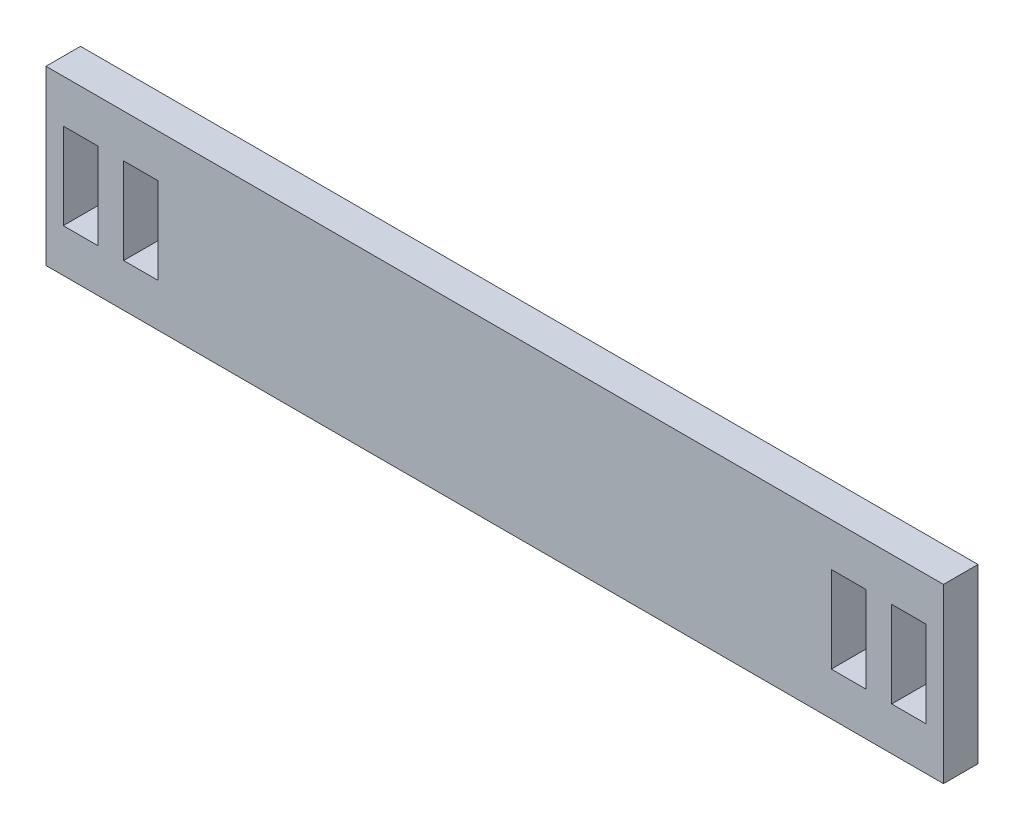
ISO-10303-21;
HEADER;
FILE_DESCRIPTION(('STEP AP214'),'2;1');
FILE_NAME('part.step','',(''),(''),'','','');
FILE_SCHEMA(('AUTOMOTIVE_DESIGN { 1 0 10303 214 1 1 1 1 }'));
ENDSEC;
DATA;
#1=APPLICATION_CONTEXT('core data for automotive mechanical design processes');
#2=APPLICATION_PROTOCOL_DEFINITION('international standard','automotive_design',2000,#1);
#3=PRODUCT_CONTEXT('',#1,'mechanical');
#4=PRODUCT('Part','Part','',(#3));
#5=PRODUCT_RELATED_PRODUCT_CATEGORY('part','',(#4));
#6=PRODUCT_DEFINITION_FORMATION('','',#4);
#7=PRODUCT_DEFINITION_CONTEXT('part definition',#1,'design');
#8=PRODUCT_DEFINITION('design','',#6,#7);
#9=PRODUCT_DEFINITION_SHAPE('','',#8);
#10=(LENGTH_UNIT() NAMED_UNIT(*) SI_UNIT(.MILLI.,.METRE.));
#11=(NAMED_UNIT(*) PLANE_ANGLE_UNIT() SI_UNIT($,.RADIAN.));
#12=(NAMED_UNIT(*) SI_UNIT($,.STERADIAN.) SOLID_ANGLE_UNIT());
#13=UNCERTAINTY_MEASURE_WITH_UNIT(LENGTH_MEASURE(1.E-05),#10,'distance_accuracy_value','');
#14=(GEOMETRIC_REPRESENTATION_CONTEXT(3) GLOBAL_UNCERTAINTY_ASSIGNED_CONTEXT((#13)) GLOBAL_UNIT_ASSIGNED_CONTEXT((#10,
#11,#12)) REPRESENTATION_CONTEXT('',''));
#15=CARTESIAN_POINT('',(0.,0.,0.));
#16=DIRECTION('',(0.,0.,1.));
#17=DIRECTION('',(1.,0.,0.));
#18=AXIS2_PLACEMENT_3D('',#15,#16,#17);
#19=CARTESIAN_POINT('',(0.,0.,2.));
#20=DIRECTION('',(0.,0.,-1.));
#21=DIRECTION('',(-1.,0.,0.));
#22=AXIS2_PLACEMENT_3D('',#19,#20,#21);
#23=PLANE('',#22);
#24=DIRECTION('',(0.,1.,0.));
#25=VECTOR('',#24,1.);
#26=CARTESIAN_POINT('',(-46.,15.,2.));
#27=LINE('',#26,#25);
#28=CARTESIAN_POINT('',(-46.,5.,2.));
#29=VERTEX_POINT('',#28);
#30=CARTESIAN_POINT('',(-46.,15.,2.));
#31=VERTEX_POINT('',#30);
#32=EDGE_CURVE('E207',#29,#31,#27,.T.);
#33=ORIENTED_EDGE('',*,*,#32,.F.);
#34=DIRECTION('',(1.,0.,0.));
#35=VECTOR('',#34,1.);
#36=CARTESIAN_POINT('',(-46.,5.,2.));
#37=LINE('',#36,#35);
#38=CARTESIAN_POINT('',(-50.,5.,2.));
#39=VERTEX_POINT('',#38);
#40=EDGE_CURVE('E215',#39,#29,#37,.T.);
#41=ORIENTED_EDGE('',*,*,#40,.F.);
#42=DIRECTION('',(0.,-1.,0.));
#43=VECTOR('',#42,1.);
#44=CARTESIAN_POINT('',(-50.,15.,2.));
#45=LINE('',#44,#43);
#46=CARTESIAN_POINT('',(-50.,15.,2.));
#47=VERTEX_POINT('',#46);
#48=EDGE_CURVE('E212',#47,#39,#45,.T.);
#49=ORIENTED_EDGE('',*,*,#48,.F.);
#50=DIRECTION('',(-1.,0.,0.));
#51=VECTOR('',#50,1.);
#52=CARTESIAN_POINT('',(-46.,15.,2.));
#53=LINE('',#52,#51);
#54=EDGE_CURVE('E209',#31,#47,#53,.T.);
#55=ORIENTED_EDGE('',*,*,#54,.F.);
#56=EDGE_LOOP('',(#33,#41,#49,#55));
#57=FACE_BOUND('',#56,.T.);
#58=DIRECTION('',(0.,-1.,0.));
#59=VECTOR('',#58,1.);
#60=CARTESIAN_POINT('',(46.,15.,2.));
#61=LINE('',#60,#59);
#62=CARTESIAN_POINT('',(46.,15.,2.));
#63=VERTEX_POINT('',#62);
#64=CARTESIAN_POINT('',(46.,5.,2.));
#65=VERTEX_POINT('',#64);
#66=EDGE_CURVE('E269',#63,#65,#61,.T.);
#67=ORIENTED_EDGE('',*,*,#66,.F.);
#68=DIRECTION('',(-1.,0.,0.));
#69=VECTOR('',#68,1.);
#70=CARTESIAN_POINT('',(46.,15.,2.));
#71=LINE('',#70,#69);
#72=CARTESIAN_POINT('',(50.,15.,2.));
#73=VERTEX_POINT('',#72);
#74=EDGE_CURVE('E277',#73,#63,#71,.T.);
#75=ORIENTED_EDGE('',*,*,#74,.F.);
#76=DIRECTION('',(0.,1.,0.));
#77=VECTOR('',#76,1.);
#78=CARTESIAN_POINT('',(50.,15.,2.));
#79=LINE('',#78,#77);
#80=CARTESIAN_POINT('',(50.,5.,2.));
#81=VERTEX_POINT('',#80);
#82=EDGE_CURVE('E274',#81,#73,#79,.T.);
#83=ORIENTED_EDGE('',*,*,#82,.F.);
#84=DIRECTION('',(1.,0.,0.));
#85=VECTOR('',#84,1.);
#86=CARTESIAN_POINT('',(46.,5.,2.));
#87=LINE('',#86,#85);
#88=EDGE_CURVE('E271',#65,#81,#87,.T.);
#89=ORIENTED_EDGE('',*,*,#88,.F.);
#90=EDGE_LOOP('',(#67,#75,#83,#89));
#91=FACE_BOUND('',#90,.T.);
#92=DIRECTION('',(1.,0.,0.));
#93=VECTOR('',#92,1.);
#94=CARTESIAN_POINT('',(-46.,0.,2.));
#95=LINE('',#94,#93);
#96=CARTESIAN_POINT('',(-52.,0.,2.));
#97=VERTEX_POINT('',#96);
#98=CARTESIAN_POINT('',(52.,0.,2.));
#99=VERTEX_POINT('',#98);
#100=EDGE_CURVE('E300',#97,#99,#95,.T.);
#101=ORIENTED_EDGE('',*,*,#100,.T.);
#102=DIRECTION('',(0.,1.,0.));
#103=VECTOR('',#102,1.);
#104=CARTESIAN_POINT('',(52.,0.,2.));
#105=LINE('',#104,#103);
#106=CARTESIAN_POINT('',(52.,20.,2.));
#107=VERTEX_POINT('',#106);
#108=EDGE_CURVE('E302',#99,#107,#105,.T.);
#109=ORIENTED_EDGE('',*,*,#108,.T.);
#110=DIRECTION('',(-1.,0.,0.));
#111=VECTOR('',#110,1.);
#112=CARTESIAN_POINT('',(52.,20.,2.));
#113=LINE('',#112,#111);
#114=CARTESIAN_POINT('',(-52.,20.,2.));
#115=VERTEX_POINT('',#114);
#116=EDGE_CURVE('E305',#107,#115,#113,.T.);
#117=ORIENTED_EDGE('',*,*,#116,.T.);
#118=DIRECTION('',(0.,-1.,0.));
#119=VECTOR('',#118,1.);
#120=CARTESIAN_POINT('',(-52.,0.,2.));
#121=LINE('',#120,#119);
#122=EDGE_CURVE('E307',#115,#97,#121,.T.);
#123=ORIENTED_EDGE('',*,*,#122,.T.);
#124=EDGE_LOOP('',(#101,#109,#117,#123));
#125=FACE_BOUND('',#124,.T.);
#126=DIRECTION('',(0.,-1.,0.));
#127=VECTOR('',#126,1.);
#128=CARTESIAN_POINT('',(-43.,15.,2.));
#129=LINE('',#128,#127);
#130=CARTESIAN_POINT('',(-43.,15.,2.));
#131=VERTEX_POINT('',#130);
#132=CARTESIAN_POINT('',(-43.,5.,2.));
#133=VERTEX_POINT('',#132);
#134=EDGE_CURVE('E238',#131,#133,#129,.T.);
#135=ORIENTED_EDGE('',*,*,#134,.F.);
#136=DIRECTION('',(-1.,0.,0.));
#137=VECTOR('',#136,1.);
#138=CARTESIAN_POINT('',(-43.,15.,2.));
#139=LINE('',#138,#137);
#140=CARTESIAN_POINT('',(-39.,15.,2.));
#141=VERTEX_POINT('',#140);
#142=EDGE_CURVE('E246',#141,#131,#139,.T.);
#143=ORIENTED_EDGE('',*,*,#142,.F.);
#144=DIRECTION('',(0.,1.,0.));
#145=VECTOR('',#144,1.);
#146=CARTESIAN_POINT('',(-39.,15.,2.));
#147=LINE('',#146,#145);
#148=CARTESIAN_POINT('',(-39.,5.,2.));
#149=VERTEX_POINT('',#148);
#150=EDGE_CURVE('E243',#149,#141,#147,.T.);
#151=ORIENTED_EDGE('',*,*,#150,.F.);
#152=DIRECTION('',(1.,0.,0.));
#153=VECTOR('',#152,1.);
#154=CARTESIAN_POINT('',(-43.,5.,2.));
#155=LINE('',#154,#153);
#156=EDGE_CURVE('E240',#133,#149,#155,.T.);
#157=ORIENTED_EDGE('',*,*,#156,.F.);
#158=EDGE_LOOP('',(#135,#143,#151,#157));
#159=FACE_BOUND('',#158,.T.);
#160=DIRECTION('',(0.,1.,0.));
#161=VECTOR('',#160,1.);
#162=CARTESIAN_POINT('',(43.,15.,2.));
#163=LINE('',#162,#161);
#164=CARTESIAN_POINT('',(43.,5.,2.));
#165=VERTEX_POINT('',#164);
#166=CARTESIAN_POINT('',(43.,15.,2.));
#167=VERTEX_POINT('',#166);
#168=EDGE_CURVE('E171',#165,#167,#163,.T.);
#169=ORIENTED_EDGE('',*,*,#168,.F.);
#170=DIRECTION('',(1.,0.,0.));
#171=VECTOR('',#170,1.);
#172=CARTESIAN_POINT('',(43.,5.,2.));
#173=LINE('',#172,#171);
#174=CARTESIAN_POINT('',(39.,5.,2.));
#175=VERTEX_POINT('',#174);
#176=EDGE_CURVE('E193',#175,#165,#173,.T.);
#177=ORIENTED_EDGE('',*,*,#176,.F.);
#178=DIRECTION('',(0.,-1.,0.));
#179=VECTOR('',#178,1.);
#180=CARTESIAN_POINT('',(39.,15.,2.));
#181=LINE('',#180,#179);
#182=CARTESIAN_POINT('',(39.,15.,2.));
#183=VERTEX_POINT('',#182);
#184=EDGE_CURVE('E191',#183,#175,#181,.T.);
#185=ORIENTED_EDGE('',*,*,#184,.F.);
#186=DIRECTION('',(-1.,0.,0.));
#187=VECTOR('',#186,1.);
#188=CARTESIAN_POINT('',(43.,15.,2.));
#189=LINE('',#188,#187);
#190=EDGE_CURVE('E179',#167,#183,#189,.T.);
#191=ORIENTED_EDGE('',*,*,#190,.F.);
#192=EDGE_LOOP('',(#169,#177,#185,#191));
#193=FACE_BOUND('',#192,.T.);
#194=ADVANCED_FACE('F34',(#57,#91,#125,#159,#193),#23,.F.);
#195=CARTESIAN_POINT('',(0.,0.,-2.));
#196=DIRECTION('',(0.,0.,-1.));
#197=DIRECTION('',(-1.,0.,0.));
#198=AXIS2_PLACEMENT_3D('',#195,#196,#197);
#199=PLANE('',#198);
#200=DIRECTION('',(1.,0.,0.));
#201=VECTOR('',#200,1.);
#202=CARTESIAN_POINT('',(52.,0.,-2.));
#203=LINE('',#202,#201);
#204=CARTESIAN_POINT('',(-52.,0.,-2.));
#205=VERTEX_POINT('',#204);
#206=CARTESIAN_POINT('',(52.,0.,-2.));
#207=VERTEX_POINT('',#206);
#208=EDGE_CURVE('E299',#205,#207,#203,.T.);
#209=ORIENTED_EDGE('',*,*,#208,.F.);
#210=DIRECTION('',(0.,-1.,0.));
#211=VECTOR('',#210,1.);
#212=CARTESIAN_POINT('',(-52.,0.,-2.));
#213=LINE('',#212,#211);
#214=CARTESIAN_POINT('',(-52.,20.,-2.));
#215=VERTEX_POINT('',#214);
#216=EDGE_CURVE('E303',#215,#205,#213,.T.);
#217=ORIENTED_EDGE('',*,*,#216,.F.);
#218=DIRECTION('',(-1.,0.,0.));
#219=VECTOR('',#218,1.);
#220=CARTESIAN_POINT('',(-46.,20.,-2.));
#221=LINE('',#220,#219);
#222=CARTESIAN_POINT('',(52.,20.,-2.));
#223=VERTEX_POINT('',#222);
#224=EDGE_CURVE('E314',#223,#215,#221,.T.);
#225=ORIENTED_EDGE('',*,*,#224,.F.);
#226=DIRECTION('',(0.,1.,0.));
#227=VECTOR('',#226,1.);
#228=CARTESIAN_POINT('',(52.,0.,-2.));
#229=LINE('',#228,#227);
#230=EDGE_CURVE('E311',#207,#223,#229,.T.);
#231=ORIENTED_EDGE('',*,*,#230,.F.);
#232=EDGE_LOOP('',(#209,#217,#225,#231));
#233=FACE_BOUND('',#232,.T.);
#234=DIRECTION('',(-1.,0.,0.));
#235=VECTOR('',#234,1.);
#236=CARTESIAN_POINT('',(46.,15.,-2.));
#237=LINE('',#236,#235);
#238=CARTESIAN_POINT('',(50.,15.,-2.));
#239=VERTEX_POINT('',#238);
#240=CARTESIAN_POINT('',(46.,15.,-2.));
#241=VERTEX_POINT('',#240);
#242=EDGE_CURVE('E272',#239,#241,#237,.T.);
#243=ORIENTED_EDGE('',*,*,#242,.T.);
#244=DIRECTION('',(0.,-1.,0.));
#245=VECTOR('',#244,1.);
#246=CARTESIAN_POINT('',(46.,15.,-2.));
#247=LINE('',#246,#245);
#248=CARTESIAN_POINT('',(46.,5.,-2.));
#249=VERTEX_POINT('',#248);
#250=EDGE_CURVE('E268',#241,#249,#247,.T.);
#251=ORIENTED_EDGE('',*,*,#250,.T.);
#252=DIRECTION('',(1.,0.,0.));
#253=VECTOR('',#252,1.);
#254=CARTESIAN_POINT('',(46.,5.,-2.));
#255=LINE('',#254,#253);
#256=CARTESIAN_POINT('',(50.,5.,-2.));
#257=VERTEX_POINT('',#256);
#258=EDGE_CURVE('E282',#249,#257,#255,.T.);
#259=ORIENTED_EDGE('',*,*,#258,.T.);
#260=DIRECTION('',(0.,1.,0.));
#261=VECTOR('',#260,1.);
#262=CARTESIAN_POINT('',(50.,15.,-2.));
#263=LINE('',#262,#261);
#264=EDGE_CURVE('E285',#257,#239,#263,.T.);
#265=ORIENTED_EDGE('',*,*,#264,.T.);
#266=EDGE_LOOP('',(#243,#251,#259,#265));
#267=FACE_BOUND('',#266,.T.);
#268=DIRECTION('',(-1.,0.,0.));
#269=VECTOR('',#268,1.);
#270=CARTESIAN_POINT('',(-43.,15.,-2.));
#271=LINE('',#270,#269);
#272=CARTESIAN_POINT('',(-39.,15.,-2.));
#273=VERTEX_POINT('',#272);
#274=CARTESIAN_POINT('',(-43.,15.,-2.));
#275=VERTEX_POINT('',#274);
#276=EDGE_CURVE('E241',#273,#275,#271,.T.);
#277=ORIENTED_EDGE('',*,*,#276,.T.);
#278=DIRECTION('',(0.,-1.,0.));
#279=VECTOR('',#278,1.);
#280=CARTESIAN_POINT('',(-43.,15.,-2.));
#281=LINE('',#280,#279);
#282=CARTESIAN_POINT('',(-43.,5.,-2.));
#283=VERTEX_POINT('',#282);
#284=EDGE_CURVE('E237',#275,#283,#281,.T.);
#285=ORIENTED_EDGE('',*,*,#284,.T.);
#286=DIRECTION('',(1.,0.,0.));
#287=VECTOR('',#286,1.);
#288=CARTESIAN_POINT('',(-43.,5.,-2.));
#289=LINE('',#288,#287);
#290=CARTESIAN_POINT('',(-39.,5.,-2.));
#291=VERTEX_POINT('',#290);
#292=EDGE_CURVE('E251',#283,#291,#289,.T.);
#293=ORIENTED_EDGE('',*,*,#292,.T.);
#294=DIRECTION('',(0.,1.,0.));
#295=VECTOR('',#294,1.);
#296=CARTESIAN_POINT('',(-39.,15.,-2.));
#297=LINE('',#296,#295);
#298=EDGE_CURVE('E254',#291,#273,#297,.T.);
#299=ORIENTED_EDGE('',*,*,#298,.T.);
#300=EDGE_LOOP('',(#277,#285,#293,#299));
#301=FACE_BOUND('',#300,.T.);
#302=DIRECTION('',(1.,0.,0.));
#303=VECTOR('',#302,1.);
#304=CARTESIAN_POINT('',(-46.,5.,-2.));
#305=LINE('',#304,#303);
#306=CARTESIAN_POINT('',(-50.,5.,-2.));
#307=VERTEX_POINT('',#306);
#308=CARTESIAN_POINT('',(-46.,5.,-2.));
#309=VERTEX_POINT('',#308);
#310=EDGE_CURVE('E210',#307,#309,#305,.T.);
#311=ORIENTED_EDGE('',*,*,#310,.T.);
#312=DIRECTION('',(0.,1.,0.));
#313=VECTOR('',#312,1.);
#314=CARTESIAN_POINT('',(-46.,15.,-2.));
#315=LINE('',#314,#313);
#316=CARTESIAN_POINT('',(-46.,15.,-2.));
#317=VERTEX_POINT('',#316);
#318=EDGE_CURVE('E187',#309,#317,#315,.T.);
#319=ORIENTED_EDGE('',*,*,#318,.T.);
#320=DIRECTION('',(-1.,0.,0.));
#321=VECTOR('',#320,1.);
#322=CARTESIAN_POINT('',(-46.,15.,-2.));
#323=LINE('',#322,#321);
#324=CARTESIAN_POINT('',(-50.,15.,-2.));
#325=VERTEX_POINT('',#324);
#326=EDGE_CURVE('E220',#317,#325,#323,.T.);
#327=ORIENTED_EDGE('',*,*,#326,.T.);
#328=DIRECTION('',(0.,-1.,0.));
#329=VECTOR('',#328,1.);
#330=CARTESIAN_POINT('',(-50.,15.,-2.));
#331=LINE('',#330,#329);
#332=EDGE_CURVE('E223',#325,#307,#331,.T.);
#333=ORIENTED_EDGE('',*,*,#332,.T.);
#334=EDGE_LOOP('',(#311,#319,#327,#333));
#335=FACE_BOUND('',#334,.T.);
#336=DIRECTION('',(1.,0.,0.));
#337=VECTOR('',#336,1.);
#338=CARTESIAN_POINT('',(43.,5.,-2.));
#339=LINE('',#338,#337);
#340=CARTESIAN_POINT('',(39.,5.,-2.));
#341=VERTEX_POINT('',#340);
#342=CARTESIAN_POINT('',(43.,5.,-2.));
#343=VERTEX_POINT('',#342);
#344=EDGE_CURVE('E180',#341,#343,#339,.T.);
#345=ORIENTED_EDGE('',*,*,#344,.T.);
#346=DIRECTION('',(0.,1.,0.));
#347=VECTOR('',#346,1.);
#348=CARTESIAN_POINT('',(43.,15.,-2.));
#349=LINE('',#348,#347);
#350=CARTESIAN_POINT('',(43.,15.,-2.));
#351=VERTEX_POINT('',#350);
#352=EDGE_CURVE('E57',#343,#351,#349,.T.);
#353=ORIENTED_EDGE('',*,*,#352,.T.);
#354=DIRECTION('',(-1.,0.,0.));
#355=VECTOR('',#354,1.);
#356=CARTESIAN_POINT('',(43.,15.,-2.));
#357=LINE('',#356,#355);
#358=CARTESIAN_POINT('',(39.,15.,-2.));
#359=VERTEX_POINT('',#358);
#360=EDGE_CURVE('E186',#351,#359,#357,.T.);
#361=ORIENTED_EDGE('',*,*,#360,.T.);
#362=DIRECTION('',(0.,-1.,0.));
#363=VECTOR('',#362,1.);
#364=CARTESIAN_POINT('',(39.,15.,-2.));
#365=LINE('',#364,#363);
#366=EDGE_CURVE('E199',#359,#341,#365,.T.);
#367=ORIENTED_EDGE('',*,*,#366,.T.);
#368=EDGE_LOOP('',(#345,#353,#361,#367));
#369=FACE_BOUND('',#368,.T.);
#370=ADVANCED_FACE('F334',(#233,#267,#301,#335,#369),#199,.T.);
#371=CARTESIAN_POINT('',(52.,0.,2.));
#372=DIRECTION('',(0.,1.,0.));
#373=DIRECTION('',(0.,0.,1.));
#374=AXIS2_PLACEMENT_3D('',#371,#372,#373);
#375=PLANE('',#374);
#376=ORIENTED_EDGE('',*,*,#208,.T.);
#377=DIRECTION('',(0.,0.,-1.));
#378=VECTOR('',#377,1.);
#379=CARTESIAN_POINT('',(52.,0.,2.));
#380=LINE('',#379,#378);
#381=EDGE_CURVE('E11',#99,#207,#380,.T.);
#382=ORIENTED_EDGE('',*,*,#381,.F.);
#383=ORIENTED_EDGE('',*,*,#100,.F.);
#384=DIRECTION('',(0.,0.,-1.));
#385=VECTOR('',#384,1.);
#386=CARTESIAN_POINT('',(-52.,0.,2.));
#387=LINE('',#386,#385);
#388=EDGE_CURVE('E309',#97,#205,#387,.T.);
#389=ORIENTED_EDGE('',*,*,#388,.T.);
#390=EDGE_LOOP('',(#376,#382,#383,#389));
#391=FACE_BOUND('',#390,.T.);
#392=ADVANCED_FACE('F36',(#391),#375,.F.);
#393=CARTESIAN_POINT('',(52.,0.,2.));
#394=DIRECTION('',(-1.,0.,0.));
#395=DIRECTION('',(0.,0.,1.));
#396=AXIS2_PLACEMENT_3D('',#393,#394,#395);
#397=PLANE('',#396);
#398=ORIENTED_EDGE('',*,*,#230,.T.);
#399=DIRECTION('',(0.,0.,-1.));
#400=VECTOR('',#399,1.);
#401=CARTESIAN_POINT('',(52.,20.,2.));
#402=LINE('',#401,#400);
#403=EDGE_CURVE('E42',#107,#223,#402,.T.);
#404=ORIENTED_EDGE('',*,*,#403,.F.);
#405=ORIENTED_EDGE('',*,*,#108,.F.);
#406=ORIENTED_EDGE('',*,*,#381,.T.);
#407=EDGE_LOOP('',(#398,#404,#405,#406));
#408=FACE_BOUND('',#407,.T.);
#409=ADVANCED_FACE('F330',(#408),#397,.F.);
#410=CARTESIAN_POINT('',(-46.,20.,2.));
#411=DIRECTION('',(0.,-1.,0.));
#412=DIRECTION('',(0.,0.,-1.));
#413=AXIS2_PLACEMENT_3D('',#410,#411,#412);
#414=PLANE('',#413);
#415=ORIENTED_EDGE('',*,*,#224,.T.);
#416=DIRECTION('',(0.,0.,-1.));
#417=VECTOR('',#416,1.);
#418=CARTESIAN_POINT('',(-52.,20.,2.));
#419=LINE('',#418,#417);
#420=EDGE_CURVE('E320',#115,#215,#419,.T.);
#421=ORIENTED_EDGE('',*,*,#420,.F.);
#422=ORIENTED_EDGE('',*,*,#116,.F.);
#423=ORIENTED_EDGE('',*,*,#403,.T.);
#424=EDGE_LOOP('',(#415,#421,#422,#423));
#425=FACE_BOUND('',#424,.T.);
#426=ADVANCED_FACE('F326',(#425),#414,.F.);
#427=CARTESIAN_POINT('',(-52.,0.,2.));
#428=DIRECTION('',(1.,0.,0.));
#429=DIRECTION('',(0.,0.,-1.));
#430=AXIS2_PLACEMENT_3D('',#427,#428,#429);
#431=PLANE('',#430);
#432=ORIENTED_EDGE('',*,*,#216,.T.);
#433=ORIENTED_EDGE('',*,*,#388,.F.);
#434=ORIENTED_EDGE('',*,*,#122,.F.);
#435=ORIENTED_EDGE('',*,*,#420,.T.);
#436=EDGE_LOOP('',(#432,#433,#434,#435));
#437=FACE_BOUND('',#436,.T.);
#438=ADVANCED_FACE('F339',(#437),#431,.F.);
#439=CARTESIAN_POINT('',(46.,15.,2.));
#440=DIRECTION('',(1.,0.,0.));
#441=DIRECTION('',(0.,0.,-1.));
#442=AXIS2_PLACEMENT_3D('',#439,#440,#441);
#443=PLANE('',#442);
#444=ORIENTED_EDGE('',*,*,#250,.F.);
#445=DIRECTION('',(0.,0.,-1.));
#446=VECTOR('',#445,1.);
#447=CARTESIAN_POINT('',(46.,15.,2.));
#448=LINE('',#447,#446);
#449=EDGE_CURVE('E279',#63,#241,#448,.T.);
#450=ORIENTED_EDGE('',*,*,#449,.F.);
#451=ORIENTED_EDGE('',*,*,#66,.T.);
#452=DIRECTION('',(0.,0.,-1.));
#453=VECTOR('',#452,1.);
#454=CARTESIAN_POINT('',(46.,5.,2.));
#455=LINE('',#454,#453);
#456=EDGE_CURVE('E296',#65,#249,#455,.T.);
#457=ORIENTED_EDGE('',*,*,#456,.T.);
#458=EDGE_LOOP('',(#444,#450,#451,#457));
#459=FACE_BOUND('',#458,.T.);
#460=ADVANCED_FACE('F391',(#459),#443,.T.);
#461=CARTESIAN_POINT('',(46.,5.,2.));
#462=DIRECTION('',(0.,1.,0.));
#463=DIRECTION('',(0.,0.,1.));
#464=AXIS2_PLACEMENT_3D('',#461,#462,#463);
#465=PLANE('',#464);
#466=ORIENTED_EDGE('',*,*,#258,.F.);
#467=ORIENTED_EDGE('',*,*,#456,.F.);
#468=ORIENTED_EDGE('',*,*,#88,.T.);
#469=DIRECTION('',(0.,0.,-1.));
#470=VECTOR('',#469,1.);
#471=CARTESIAN_POINT('',(50.,5.,2.));
#472=LINE('',#471,#470);
#473=EDGE_CURVE('E294',#81,#257,#472,.T.);
#474=ORIENTED_EDGE('',*,*,#473,.T.);
#475=EDGE_LOOP('',(#466,#467,#468,#474));
#476=FACE_BOUND('',#475,.T.);
#477=ADVANCED_FACE('F387',(#476),#465,.T.);
#478=CARTESIAN_POINT('',(50.,15.,2.));
#479=DIRECTION('',(-1.,0.,0.));
#480=DIRECTION('',(0.,0.,1.));
#481=AXIS2_PLACEMENT_3D('',#478,#479,#480);
#482=PLANE('',#481);
#483=ORIENTED_EDGE('',*,*,#264,.F.);
#484=ORIENTED_EDGE('',*,*,#473,.F.);
#485=ORIENTED_EDGE('',*,*,#82,.T.);
#486=DIRECTION('',(0.,0.,-1.));
#487=VECTOR('',#486,1.);
#488=CARTESIAN_POINT('',(50.,15.,2.));
#489=LINE('',#488,#487);
#490=EDGE_CURVE('E292',#73,#239,#489,.T.);
#491=ORIENTED_EDGE('',*,*,#490,.T.);
#492=EDGE_LOOP('',(#483,#484,#485,#491));
#493=FACE_BOUND('',#492,.T.);
#494=ADVANCED_FACE('F383',(#493),#482,.T.);
#495=CARTESIAN_POINT('',(46.,15.,2.));
#496=DIRECTION('',(0.,-1.,0.));
#497=DIRECTION('',(0.,0.,-1.));
#498=AXIS2_PLACEMENT_3D('',#495,#496,#497);
#499=PLANE('',#498);
#500=ORIENTED_EDGE('',*,*,#242,.F.);
#501=ORIENTED_EDGE('',*,*,#490,.F.);
#502=ORIENTED_EDGE('',*,*,#74,.T.);
#503=ORIENTED_EDGE('',*,*,#449,.T.);
#504=EDGE_LOOP('',(#500,#501,#502,#503));
#505=FACE_BOUND('',#504,.T.);
#506=ADVANCED_FACE('F380',(#505),#499,.T.);
#507=CARTESIAN_POINT('',(-43.,15.,2.));
#508=DIRECTION('',(1.,0.,0.));
#509=DIRECTION('',(0.,0.,-1.));
#510=AXIS2_PLACEMENT_3D('',#507,#508,#509);
#511=PLANE('',#510);
#512=ORIENTED_EDGE('',*,*,#284,.F.);
#513=DIRECTION('',(0.,0.,-1.));
#514=VECTOR('',#513,1.);
#515=CARTESIAN_POINT('',(-43.,15.,2.));
#516=LINE('',#515,#514);
#517=EDGE_CURVE('E248',#131,#275,#516,.T.);
#518=ORIENTED_EDGE('',*,*,#517,.F.);
#519=ORIENTED_EDGE('',*,*,#134,.T.);
#520=DIRECTION('',(0.,0.,-1.));
#521=VECTOR('',#520,1.);
#522=CARTESIAN_POINT('',(-43.,5.,2.));
#523=LINE('',#522,#521);
#524=EDGE_CURVE('E265',#133,#283,#523,.T.);
#525=ORIENTED_EDGE('',*,*,#524,.T.);
#526=EDGE_LOOP('',(#512,#518,#519,#525));
#527=FACE_BOUND('',#526,.T.);
#528=ADVANCED_FACE('F355',(#527),#511,.T.);
#529=CARTESIAN_POINT('',(-43.,5.,2.));
#530=DIRECTION('',(0.,1.,0.));
#531=DIRECTION('',(0.,0.,1.));
#532=AXIS2_PLACEMENT_3D('',#529,#530,#531);
#533=PLANE('',#532);
#534=ORIENTED_EDGE('',*,*,#292,.F.);
#535=ORIENTED_EDGE('',*,*,#524,.F.);
#536=ORIENTED_EDGE('',*,*,#156,.T.);
#537=DIRECTION('',(0.,0.,-1.));
#538=VECTOR('',#537,1.);
#539=CARTESIAN_POINT('',(-39.,5.,2.));
#540=LINE('',#539,#538);
#541=EDGE_CURVE('E263',#149,#291,#540,.T.);
#542=ORIENTED_EDGE('',*,*,#541,.T.);
#543=EDGE_LOOP('',(#534,#535,#536,#542));
#544=FACE_BOUND('',#543,.T.);
#545=ADVANCED_FACE('F357',(#544),#533,.T.);
#546=CARTESIAN_POINT('',(-39.,15.,2.));
#547=DIRECTION('',(-1.,0.,0.));
#548=DIRECTION('',(0.,0.,1.));
#549=AXIS2_PLACEMENT_3D('',#546,#547,#548);
#550=PLANE('',#549);
#551=ORIENTED_EDGE('',*,*,#298,.F.);
#552=ORIENTED_EDGE('',*,*,#541,.F.);
#553=ORIENTED_EDGE('',*,*,#150,.T.);
#554=DIRECTION('',(0.,0.,-1.));
#555=VECTOR('',#554,1.);
#556=CARTESIAN_POINT('',(-39.,15.,2.));
#557=LINE('',#556,#555);
#558=EDGE_CURVE('E261',#141,#273,#557,.T.);
#559=ORIENTED_EDGE('',*,*,#558,.T.);
#560=EDGE_LOOP('',(#551,#552,#553,#559));
#561=FACE_BOUND('',#560,.T.);
#562=ADVANCED_FACE('F366',(#561),#550,.T.);
#563=CARTESIAN_POINT('',(-43.,15.,2.));
#564=DIRECTION('',(0.,-1.,0.));
#565=DIRECTION('',(0.,0.,-1.));
#566=AXIS2_PLACEMENT_3D('',#563,#564,#565);
#567=PLANE('',#566);
#568=ORIENTED_EDGE('',*,*,#276,.F.);
#569=ORIENTED_EDGE('',*,*,#558,.F.);
#570=ORIENTED_EDGE('',*,*,#142,.T.);
#571=ORIENTED_EDGE('',*,*,#517,.T.);
#572=EDGE_LOOP('',(#568,#569,#570,#571));
#573=FACE_BOUND('',#572,.T.);
#574=ADVANCED_FACE('F364',(#573),#567,.T.);
#575=CARTESIAN_POINT('',(-46.,15.,2.));
#576=DIRECTION('',(-1.,0.,0.));
#577=DIRECTION('',(0.,0.,1.));
#578=AXIS2_PLACEMENT_3D('',#575,#576,#577);
#579=PLANE('',#578);
#580=ORIENTED_EDGE('',*,*,#318,.F.);
#581=DIRECTION('',(0.,0.,-1.));
#582=VECTOR('',#581,1.);
#583=CARTESIAN_POINT('',(-46.,5.,2.));
#584=LINE('',#583,#582);
#585=EDGE_CURVE('E217',#29,#309,#584,.T.);
#586=ORIENTED_EDGE('',*,*,#585,.F.);
#587=ORIENTED_EDGE('',*,*,#32,.T.);
#588=DIRECTION('',(0.,0.,-1.));
#589=VECTOR('',#588,1.);
#590=CARTESIAN_POINT('',(-46.,15.,2.));
#591=LINE('',#590,#589);
#592=EDGE_CURVE('E234',#31,#317,#591,.T.);
#593=ORIENTED_EDGE('',*,*,#592,.T.);
#594=EDGE_LOOP('',(#580,#586,#587,#593));
#595=FACE_BOUND('',#594,.T.);
#596=ADVANCED_FACE('F373',(#595),#579,.T.);
#597=CARTESIAN_POINT('',(-46.,15.,2.));
#598=DIRECTION('',(0.,-1.,0.));
#599=DIRECTION('',(0.,0.,-1.));
#600=AXIS2_PLACEMENT_3D('',#597,#598,#599);
#601=PLANE('',#600);
#602=ORIENTED_EDGE('',*,*,#326,.F.);
#603=ORIENTED_EDGE('',*,*,#592,.F.);
#604=ORIENTED_EDGE('',*,*,#54,.T.);
#605=DIRECTION('',(0.,0.,-1.));
#606=VECTOR('',#605,1.);
#607=CARTESIAN_POINT('',(-50.,15.,2.));
#608=LINE('',#607,#606);
#609=EDGE_CURVE('E232',#47,#325,#608,.T.);
#610=ORIENTED_EDGE('',*,*,#609,.T.);
#611=EDGE_LOOP('',(#602,#603,#604,#610));
#612=FACE_BOUND('',#611,.T.);
#613=ADVANCED_FACE('F494',(#612),#601,.T.);
#614=CARTESIAN_POINT('',(-50.,15.,2.));
#615=DIRECTION('',(1.,0.,0.));
#616=DIRECTION('',(0.,0.,-1.));
#617=AXIS2_PLACEMENT_3D('',#614,#615,#616);
#618=PLANE('',#617);
#619=ORIENTED_EDGE('',*,*,#332,.F.);
#620=ORIENTED_EDGE('',*,*,#609,.F.);
#621=ORIENTED_EDGE('',*,*,#48,.T.);
#622=DIRECTION('',(0.,0.,-1.));
#623=VECTOR('',#622,1.);
#624=CARTESIAN_POINT('',(-50.,5.,2.));
#625=LINE('',#624,#623);
#626=EDGE_CURVE('E230',#39,#307,#625,.T.);
#627=ORIENTED_EDGE('',*,*,#626,.T.);
#628=EDGE_LOOP('',(#619,#620,#621,#627));
#629=FACE_BOUND('',#628,.T.);
#630=ADVANCED_FACE('F502',(#629),#618,.T.);
#631=CARTESIAN_POINT('',(-46.,5.,2.));
#632=DIRECTION('',(0.,1.,0.));
#633=DIRECTION('',(0.,0.,1.));
#634=AXIS2_PLACEMENT_3D('',#631,#632,#633);
#635=PLANE('',#634);
#636=ORIENTED_EDGE('',*,*,#310,.F.);
#637=ORIENTED_EDGE('',*,*,#626,.F.);
#638=ORIENTED_EDGE('',*,*,#40,.T.);
#639=ORIENTED_EDGE('',*,*,#585,.T.);
#640=EDGE_LOOP('',(#636,#637,#638,#639));
#641=FACE_BOUND('',#640,.T.);
#642=ADVANCED_FACE('F511',(#641),#635,.T.);
#643=CARTESIAN_POINT('',(43.,15.,2.));
#644=DIRECTION('',(-1.,0.,0.));
#645=DIRECTION('',(0.,0.,1.));
#646=AXIS2_PLACEMENT_3D('',#643,#644,#645);
#647=PLANE('',#646);
#648=ORIENTED_EDGE('',*,*,#352,.F.);
#649=DIRECTION('',(0.,0.,-1.));
#650=VECTOR('',#649,1.);
#651=CARTESIAN_POINT('',(43.,5.,2.));
#652=LINE('',#651,#650);
#653=EDGE_CURVE('E175',#165,#343,#652,.T.);
#654=ORIENTED_EDGE('',*,*,#653,.F.);
#655=ORIENTED_EDGE('',*,*,#168,.T.);
#656=DIRECTION('',(0.,0.,-1.));
#657=VECTOR('',#656,1.);
#658=CARTESIAN_POINT('',(43.,15.,2.));
#659=LINE('',#658,#657);
#660=EDGE_CURVE('E174',#167,#351,#659,.T.);
#661=ORIENTED_EDGE('',*,*,#660,.T.);
#662=EDGE_LOOP('',(#648,#654,#655,#661));
#663=FACE_BOUND('',#662,.T.);
#664=ADVANCED_FACE('F173',(#663),#647,.T.);
#665=CARTESIAN_POINT('',(43.,15.,2.));
#666=DIRECTION('',(0.,-1.,0.));
#667=DIRECTION('',(0.,0.,-1.));
#668=AXIS2_PLACEMENT_3D('',#665,#666,#667);
#669=PLANE('',#668);
#670=ORIENTED_EDGE('',*,*,#360,.F.);
#671=ORIENTED_EDGE('',*,*,#660,.F.);
#672=ORIENTED_EDGE('',*,*,#190,.T.);
#673=DIRECTION('',(0.,0.,-1.));
#674=VECTOR('',#673,1.);
#675=CARTESIAN_POINT('',(39.,15.,2.));
#676=LINE('',#675,#674);
#677=EDGE_CURVE('E188',#183,#359,#676,.T.);
#678=ORIENTED_EDGE('',*,*,#677,.T.);
#679=EDGE_LOOP('',(#670,#671,#672,#678));
#680=FACE_BOUND('',#679,.T.);
#681=ADVANCED_FACE('F183',(#680),#669,.T.);
#682=CARTESIAN_POINT('',(39.,15.,2.));
#683=DIRECTION('',(1.,0.,0.));
#684=DIRECTION('',(0.,0.,-1.));
#685=AXIS2_PLACEMENT_3D('',#682,#683,#684);
#686=PLANE('',#685);
#687=ORIENTED_EDGE('',*,*,#366,.F.);
#688=ORIENTED_EDGE('',*,*,#677,.F.);
#689=ORIENTED_EDGE('',*,*,#184,.T.);
#690=DIRECTION('',(0.,0.,-1.));
#691=VECTOR('',#690,1.);
#692=CARTESIAN_POINT('',(39.,5.,2.));
#693=LINE('',#692,#691);
#694=EDGE_CURVE('E49',#175,#341,#693,.T.);
#695=ORIENTED_EDGE('',*,*,#694,.T.);
#696=EDGE_LOOP('',(#687,#688,#689,#695));
#697=FACE_BOUND('',#696,.T.);
#698=ADVANCED_FACE('F535',(#697),#686,.T.);
#699=CARTESIAN_POINT('',(43.,5.,2.));
#700=DIRECTION('',(0.,1.,0.));
#701=DIRECTION('',(0.,0.,1.));
#702=AXIS2_PLACEMENT_3D('',#699,#700,#701);
#703=PLANE('',#702);
#704=ORIENTED_EDGE('',*,*,#344,.F.);
#705=ORIENTED_EDGE('',*,*,#694,.F.);
#706=ORIENTED_EDGE('',*,*,#176,.T.);
#707=ORIENTED_EDGE('',*,*,#653,.T.);
#708=EDGE_LOOP('',(#704,#705,#706,#707));
#709=FACE_BOUND('',#708,.T.);
#710=ADVANCED_FACE('F543',(#709),#703,.T.);
#711=CLOSED_SHELL('',(#194,#370,#392,#409,#426,#438,#460,#477,#494,#506,#528,#545,#562,#574,
#596,#613,#630,#642,#664,#681,#698,#710));
#712=MANIFOLD_SOLID_BREP('B2',#711);
#713=ADVANCED_BREP_SHAPE_REPRESENTATION('',(#18,#712),#14);
#714=SHAPE_DEFINITION_REPRESENTATION(#9,#713);
ENDSEC;
END-ISO-10303-21;
